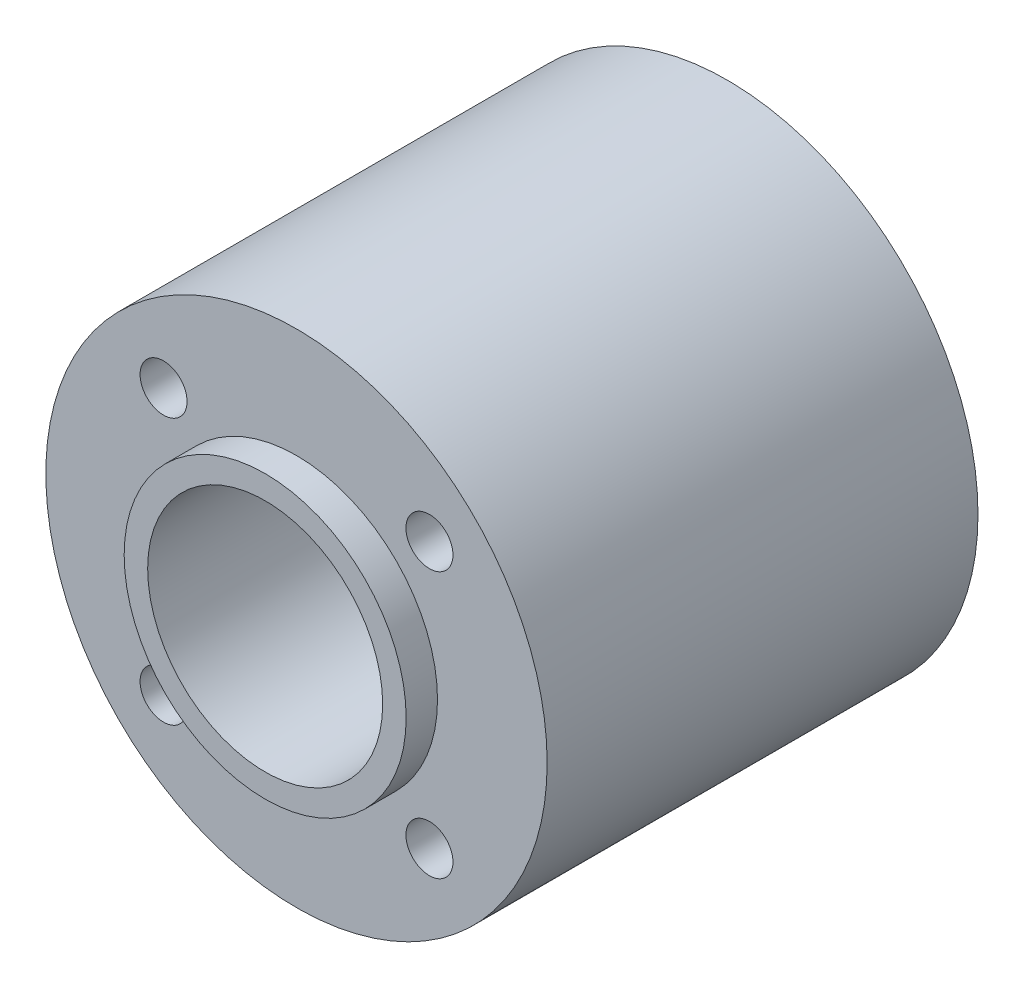
ISO-10303-21;
HEADER;
FILE_DESCRIPTION(('STEP AP214'),'2;1');
FILE_NAME('part.step','',(''),(''),'','','');
FILE_SCHEMA(('AUTOMOTIVE_DESIGN { 1 0 10303 214 1 1 1 1 }'));
ENDSEC;
DATA;
#1=APPLICATION_CONTEXT('core data for automotive mechanical design processes');
#2=APPLICATION_PROTOCOL_DEFINITION('international standard','automotive_design',2000,#1);
#3=PRODUCT_CONTEXT('',#1,'mechanical');
#4=PRODUCT('Part','Part','',(#3));
#5=PRODUCT_RELATED_PRODUCT_CATEGORY('part','',(#4));
#6=PRODUCT_DEFINITION_FORMATION('','',#4);
#7=PRODUCT_DEFINITION_CONTEXT('part definition',#1,'design');
#8=PRODUCT_DEFINITION('design','',#6,#7);
#9=PRODUCT_DEFINITION_SHAPE('','',#8);
#10=(LENGTH_UNIT() NAMED_UNIT(*) SI_UNIT(.MILLI.,.METRE.));
#11=(NAMED_UNIT(*) PLANE_ANGLE_UNIT() SI_UNIT($,.RADIAN.));
#12=(NAMED_UNIT(*) SI_UNIT($,.STERADIAN.) SOLID_ANGLE_UNIT());
#13=UNCERTAINTY_MEASURE_WITH_UNIT(LENGTH_MEASURE(1.E-05),#10,'distance_accuracy_value','');
#14=(GEOMETRIC_REPRESENTATION_CONTEXT(3) GLOBAL_UNCERTAINTY_ASSIGNED_CONTEXT((#13)) GLOBAL_UNIT_ASSIGNED_CONTEXT((#10,
#11,#12)) REPRESENTATION_CONTEXT('',''));
#15=CARTESIAN_POINT('',(0.,0.,0.));
#16=DIRECTION('',(0.,0.,1.));
#17=DIRECTION('',(1.,0.,0.));
#18=AXIS2_PLACEMENT_3D('',#15,#16,#17);
#19=CARTESIAN_POINT('',(0.,0.,-27.5));
#20=DIRECTION('',(0.,0.,1.));
#21=DIRECTION('',(1.,0.,0.));
#22=AXIS2_PLACEMENT_3D('',#19,#20,#21);
#23=CYLINDRICAL_SURFACE('',#22,16.);
#24=CARTESIAN_POINT('',(0.,0.,-27.5));
#25=DIRECTION('',(0.,0.,1.));
#26=DIRECTION('',(1.,0.,0.));
#27=AXIS2_PLACEMENT_3D('',#24,#25,#26);
#28=CIRCLE('',#27,16.);
#29=CARTESIAN_POINT('',(16.,0.,-27.5));
#30=VERTEX_POINT('',#29);
#31=EDGE_CURVE('E11',#30,#30,#28,.T.);
#32=ORIENTED_EDGE('',*,*,#31,.T.);
#33=EDGE_LOOP('',(#32));
#34=FACE_BOUND('',#33,.T.);
#35=CARTESIAN_POINT('',(0.,0.,0.));
#36=DIRECTION('',(0.,0.,1.));
#37=DIRECTION('',(1.,0.,0.));
#38=AXIS2_PLACEMENT_3D('',#35,#36,#37);
#39=CIRCLE('',#38,16.);
#40=CARTESIAN_POINT('',(16.,0.,0.));
#41=VERTEX_POINT('',#40);
#42=EDGE_CURVE('E48',#41,#41,#39,.T.);
#43=ORIENTED_EDGE('',*,*,#42,.F.);
#44=EDGE_LOOP('',(#43));
#45=FACE_BOUND('',#44,.T.);
#46=ADVANCED_FACE('F45',(#34,#45),#23,.T.);
#47=CARTESIAN_POINT('',(0.,0.,-27.5));
#48=DIRECTION('',(0.,0.,1.));
#49=DIRECTION('',(1.,0.,0.));
#50=AXIS2_PLACEMENT_3D('',#47,#48,#49);
#51=CYLINDRICAL_SURFACE('',#50,7.5);
#52=CARTESIAN_POINT('',(0.,0.,2.));
#53=DIRECTION('',(0.,0.,1.));
#54=DIRECTION('',(1.,0.,0.));
#55=AXIS2_PLACEMENT_3D('',#52,#53,#54);
#56=CIRCLE('',#55,7.5);
#57=CARTESIAN_POINT('',(7.5,0.,2.));
#58=VERTEX_POINT('',#57);
#59=EDGE_CURVE('E60',#58,#58,#56,.T.);
#60=ORIENTED_EDGE('',*,*,#59,.T.);
#61=EDGE_LOOP('',(#60));
#62=FACE_BOUND('',#61,.T.);
#63=CARTESIAN_POINT('',(0.,0.,-29.5));
#64=DIRECTION('',(0.,0.,1.));
#65=DIRECTION('',(1.,0.,0.));
#66=AXIS2_PLACEMENT_3D('',#63,#64,#65);
#67=CIRCLE('',#66,7.5);
#68=CARTESIAN_POINT('',(7.5,0.,-29.5));
#69=VERTEX_POINT('',#68);
#70=EDGE_CURVE('E69',#69,#69,#67,.T.);
#71=ORIENTED_EDGE('',*,*,#70,.F.);
#72=EDGE_LOOP('',(#71));
#73=FACE_BOUND('',#72,.T.);
#74=ADVANCED_FACE('F116',(#62,#73),#51,.F.);
#75=CARTESIAN_POINT('',(0.,0.,-27.5));
#76=DIRECTION('',(0.,0.,1.));
#77=DIRECTION('',(1.,0.,0.));
#78=AXIS2_PLACEMENT_3D('',#75,#76,#77);
#79=PLANE('',#78);
#80=CARTESIAN_POINT('',(-8.48528137423814,-8.48528137423853,-27.5));
#81=DIRECTION('',(0.,0.,1.));
#82=DIRECTION('',(1.,0.,0.));
#83=AXIS2_PLACEMENT_3D('',#80,#81,#82);
#84=CIRCLE('',#83,1.50000000000026);
#85=CARTESIAN_POINT('',(-6.98528137423788,-8.48528137423853,-27.5));
#86=VERTEX_POINT('',#85);
#87=EDGE_CURVE('E74',#86,#86,#84,.T.);
#88=ORIENTED_EDGE('',*,*,#87,.T.);
#89=EDGE_LOOP('',(#88));
#90=FACE_BOUND('',#89,.T.);
#91=CARTESIAN_POINT('',(8.48528137423901,-8.48528137423814,-27.5));
#92=DIRECTION('',(0.,0.,1.));
#93=DIRECTION('',(1.,0.,0.));
#94=AXIS2_PLACEMENT_3D('',#91,#92,#93);
#95=CIRCLE('',#94,1.50000000000067);
#96=CARTESIAN_POINT('',(9.98528137423968,-8.48528137423814,-27.5));
#97=VERTEX_POINT('',#96);
#98=EDGE_CURVE('E77',#97,#97,#95,.T.);
#99=ORIENTED_EDGE('',*,*,#98,.T.);
#100=EDGE_LOOP('',(#99));
#101=FACE_BOUND('',#100,.T.);
#102=CARTESIAN_POINT('',(8.48528137423862,8.485281374239,-27.5));
#103=DIRECTION('',(0.,0.,1.));
#104=DIRECTION('',(1.,0.,0.));
#105=AXIS2_PLACEMENT_3D('',#102,#103,#104);
#106=CIRCLE('',#105,1.50000000000049);
#107=CARTESIAN_POINT('',(9.98528137423911,8.485281374239,-27.5));
#108=VERTEX_POINT('',#107);
#109=EDGE_CURVE('E80',#108,#108,#106,.T.);
#110=ORIENTED_EDGE('',*,*,#109,.T.);
#111=EDGE_LOOP('',(#110));
#112=FACE_BOUND('',#111,.T.);
#113=CARTESIAN_POINT('',(-8.48528137423853,8.48528137423861,-27.5));
#114=DIRECTION('',(0.,0.,1.));
#115=DIRECTION('',(1.,0.,0.));
#116=AXIS2_PLACEMENT_3D('',#113,#114,#115);
#117=CIRCLE('',#116,1.5);
#118=CARTESIAN_POINT('',(-6.98528137423853,8.48528137423861,-27.5));
#119=VERTEX_POINT('',#118);
#120=EDGE_CURVE('E83',#119,#119,#117,.T.);
#121=ORIENTED_EDGE('',*,*,#120,.T.);
#122=EDGE_LOOP('',(#121));
#123=FACE_BOUND('',#122,.T.);
#124=CARTESIAN_POINT('',(0.,0.,-27.5));
#125=DIRECTION('',(0.,0.,1.));
#126=DIRECTION('',(1.,0.,0.));
#127=AXIS2_PLACEMENT_3D('',#124,#125,#126);
#128=CIRCLE('',#127,9.);
#129=CARTESIAN_POINT('',(9.,0.,-27.5));
#130=VERTEX_POINT('',#129);
#131=EDGE_CURVE('E66',#130,#130,#128,.T.);
#132=ORIENTED_EDGE('',*,*,#131,.T.);
#133=EDGE_LOOP('',(#132));
#134=FACE_BOUND('',#133,.T.);
#135=ORIENTED_EDGE('',*,*,#31,.F.);
#136=EDGE_LOOP('',(#135));
#137=FACE_BOUND('',#136,.T.);
#138=ADVANCED_FACE('F106',(#90,#101,#112,#123,#134,#137),#79,.F.);
#139=CARTESIAN_POINT('',(0.,0.,0.));
#140=DIRECTION('',(0.,0.,1.));
#141=DIRECTION('',(1.,0.,0.));
#142=AXIS2_PLACEMENT_3D('',#139,#140,#141);
#143=PLANE('',#142);
#144=CARTESIAN_POINT('',(-8.48528137423814,-8.48528137423853,0.));
#145=DIRECTION('',(0.,0.,1.));
#146=DIRECTION('',(1.,0.,0.));
#147=AXIS2_PLACEMENT_3D('',#144,#145,#146);
#148=CIRCLE('',#147,1.50000000000026);
#149=CARTESIAN_POINT('',(-6.98528137423788,-8.48528137423853,0.));
#150=VERTEX_POINT('',#149);
#151=EDGE_CURVE('E90',#150,#150,#148,.T.);
#152=ORIENTED_EDGE('',*,*,#151,.F.);
#153=EDGE_LOOP('',(#152));
#154=FACE_BOUND('',#153,.T.);
#155=CARTESIAN_POINT('',(8.48528137423901,-8.48528137423814,0.));
#156=DIRECTION('',(0.,0.,1.));
#157=DIRECTION('',(1.,0.,0.));
#158=AXIS2_PLACEMENT_3D('',#155,#156,#157);
#159=CIRCLE('',#158,1.50000000000067);
#160=CARTESIAN_POINT('',(9.98528137423968,-8.48528137423814,0.));
#161=VERTEX_POINT('',#160);
#162=EDGE_CURVE('E93',#161,#161,#159,.T.);
#163=ORIENTED_EDGE('',*,*,#162,.F.);
#164=EDGE_LOOP('',(#163));
#165=FACE_BOUND('',#164,.T.);
#166=CARTESIAN_POINT('',(8.48528137423862,8.485281374239,0.));
#167=DIRECTION('',(0.,0.,1.));
#168=DIRECTION('',(1.,0.,0.));
#169=AXIS2_PLACEMENT_3D('',#166,#167,#168);
#170=CIRCLE('',#169,1.50000000000049);
#171=CARTESIAN_POINT('',(9.98528137423911,8.485281374239,0.));
#172=VERTEX_POINT('',#171);
#173=EDGE_CURVE('E89',#172,#172,#170,.T.);
#174=ORIENTED_EDGE('',*,*,#173,.F.);
#175=EDGE_LOOP('',(#174));
#176=FACE_BOUND('',#175,.T.);
#177=CARTESIAN_POINT('',(-8.48528137423853,8.48528137423861,0.));
#178=DIRECTION('',(0.,0.,1.));
#179=DIRECTION('',(1.,0.,0.));
#180=AXIS2_PLACEMENT_3D('',#177,#178,#179);
#181=CIRCLE('',#180,1.5);
#182=CARTESIAN_POINT('',(-6.98528137423853,8.48528137423861,0.));
#183=VERTEX_POINT('',#182);
#184=EDGE_CURVE('E86',#183,#183,#181,.T.);
#185=ORIENTED_EDGE('',*,*,#184,.F.);
#186=EDGE_LOOP('',(#185));
#187=FACE_BOUND('',#186,.T.);
#188=CARTESIAN_POINT('',(0.,0.,0.));
#189=DIRECTION('',(0.,0.,1.));
#190=DIRECTION('',(1.,0.,0.));
#191=AXIS2_PLACEMENT_3D('',#188,#189,#190);
#192=CIRCLE('',#191,9.);
#193=CARTESIAN_POINT('',(9.,0.,0.));
#194=VERTEX_POINT('',#193);
#195=EDGE_CURVE('E57',#194,#194,#192,.T.);
#196=ORIENTED_EDGE('',*,*,#195,.F.);
#197=EDGE_LOOP('',(#196));
#198=FACE_BOUND('',#197,.T.);
#199=ORIENTED_EDGE('',*,*,#42,.T.);
#200=EDGE_LOOP('',(#199));
#201=FACE_BOUND('',#200,.T.);
#202=ADVANCED_FACE('F102',(#154,#165,#176,#187,#198,#201),#143,.T.);
#203=CARTESIAN_POINT('',(0.,0.,2.));
#204=DIRECTION('',(0.,0.,-1.));
#205=DIRECTION('',(-1.,0.,0.));
#206=AXIS2_PLACEMENT_3D('',#203,#204,#205);
#207=CYLINDRICAL_SURFACE('',#206,9.);
#208=CARTESIAN_POINT('',(0.,0.,2.));
#209=DIRECTION('',(0.,0.,1.));
#210=DIRECTION('',(1.,0.,0.));
#211=AXIS2_PLACEMENT_3D('',#208,#209,#210);
#212=CIRCLE('',#211,9.);
#213=CARTESIAN_POINT('',(9.,0.,2.));
#214=VERTEX_POINT('',#213);
#215=EDGE_CURVE('E55',#214,#214,#212,.T.);
#216=ORIENTED_EDGE('',*,*,#215,.F.);
#217=EDGE_LOOP('',(#216));
#218=FACE_BOUND('',#217,.T.);
#219=ORIENTED_EDGE('',*,*,#195,.T.);
#220=EDGE_LOOP('',(#219));
#221=FACE_BOUND('',#220,.T.);
#222=ADVANCED_FACE('F105',(#218,#221),#207,.T.);
#223=CARTESIAN_POINT('',(0.,0.,2.));
#224=DIRECTION('',(0.,0.,1.));
#225=DIRECTION('',(1.,0.,0.));
#226=AXIS2_PLACEMENT_3D('',#223,#224,#225);
#227=PLANE('',#226);
#228=ORIENTED_EDGE('',*,*,#59,.F.);
#229=EDGE_LOOP('',(#228));
#230=FACE_BOUND('',#229,.T.);
#231=ORIENTED_EDGE('',*,*,#215,.T.);
#232=EDGE_LOOP('',(#231));
#233=FACE_BOUND('',#232,.T.);
#234=ADVANCED_FACE('F130',(#230,#233),#227,.T.);
#235=CARTESIAN_POINT('',(0.,0.,-29.5));
#236=DIRECTION('',(0.,0.,1.));
#237=DIRECTION('',(1.,0.,0.));
#238=AXIS2_PLACEMENT_3D('',#235,#236,#237);
#239=CYLINDRICAL_SURFACE('',#238,9.);
#240=CARTESIAN_POINT('',(0.,0.,-29.5));
#241=DIRECTION('',(0.,0.,1.));
#242=DIRECTION('',(1.,0.,0.));
#243=AXIS2_PLACEMENT_3D('',#240,#241,#242);
#244=CIRCLE('',#243,9.);
#245=CARTESIAN_POINT('',(9.,0.,-29.5));
#246=VERTEX_POINT('',#245);
#247=EDGE_CURVE('E61',#246,#246,#244,.T.);
#248=ORIENTED_EDGE('',*,*,#247,.T.);
#249=EDGE_LOOP('',(#248));
#250=FACE_BOUND('',#249,.T.);
#251=ORIENTED_EDGE('',*,*,#131,.F.);
#252=EDGE_LOOP('',(#251));
#253=FACE_BOUND('',#252,.T.);
#254=ADVANCED_FACE('F134',(#250,#253),#239,.T.);
#255=CARTESIAN_POINT('',(0.,0.,-29.5));
#256=DIRECTION('',(0.,0.,1.));
#257=DIRECTION('',(1.,0.,0.));
#258=AXIS2_PLACEMENT_3D('',#255,#256,#257);
#259=PLANE('',#258);
#260=ORIENTED_EDGE('',*,*,#70,.T.);
#261=EDGE_LOOP('',(#260));
#262=FACE_BOUND('',#261,.T.);
#263=ORIENTED_EDGE('',*,*,#247,.F.);
#264=EDGE_LOOP('',(#263));
#265=FACE_BOUND('',#264,.T.);
#266=ADVANCED_FACE('F138',(#262,#265),#259,.F.);
#267=CARTESIAN_POINT('',(-8.48528137423853,8.48528137423861,-29.5));
#268=DIRECTION('',(0.,0.,1.));
#269=DIRECTION('',(1.,0.,0.));
#270=AXIS2_PLACEMENT_3D('',#267,#268,#269);
#271=CYLINDRICAL_SURFACE('',#270,1.5);
#272=ORIENTED_EDGE('',*,*,#184,.T.);
#273=EDGE_LOOP('',(#272));
#274=FACE_BOUND('',#273,.T.);
#275=ORIENTED_EDGE('',*,*,#120,.F.);
#276=EDGE_LOOP('',(#275));
#277=FACE_BOUND('',#276,.T.);
#278=ADVANCED_FACE('F142',(#274,#277),#271,.F.);
#279=CARTESIAN_POINT('',(8.48528137423862,8.485281374239,-29.5));
#280=DIRECTION('',(0.,0.,1.));
#281=DIRECTION('',(1.,0.,0.));
#282=AXIS2_PLACEMENT_3D('',#279,#280,#281);
#283=CYLINDRICAL_SURFACE('',#282,1.50000000000049);
#284=ORIENTED_EDGE('',*,*,#173,.T.);
#285=EDGE_LOOP('',(#284));
#286=FACE_BOUND('',#285,.T.);
#287=ORIENTED_EDGE('',*,*,#109,.F.);
#288=EDGE_LOOP('',(#287));
#289=FACE_BOUND('',#288,.T.);
#290=ADVANCED_FACE('F99',(#286,#289),#283,.F.);
#291=CARTESIAN_POINT('',(8.48528137423901,-8.48528137423814,-29.5));
#292=DIRECTION('',(0.,0.,1.));
#293=DIRECTION('',(1.,0.,0.));
#294=AXIS2_PLACEMENT_3D('',#291,#292,#293);
#295=CYLINDRICAL_SURFACE('',#294,1.50000000000067);
#296=ORIENTED_EDGE('',*,*,#162,.T.);
#297=EDGE_LOOP('',(#296));
#298=FACE_BOUND('',#297,.T.);
#299=ORIENTED_EDGE('',*,*,#98,.F.);
#300=EDGE_LOOP('',(#299));
#301=FACE_BOUND('',#300,.T.);
#302=ADVANCED_FACE('F150',(#298,#301),#295,.F.);
#303=CARTESIAN_POINT('',(-8.48528137423814,-8.48528137423853,-29.5));
#304=DIRECTION('',(0.,0.,1.));
#305=DIRECTION('',(1.,0.,0.));
#306=AXIS2_PLACEMENT_3D('',#303,#304,#305);
#307=CYLINDRICAL_SURFACE('',#306,1.50000000000026);
#308=ORIENTED_EDGE('',*,*,#151,.T.);
#309=EDGE_LOOP('',(#308));
#310=FACE_BOUND('',#309,.T.);
#311=ORIENTED_EDGE('',*,*,#87,.F.);
#312=EDGE_LOOP('',(#311));
#313=FACE_BOUND('',#312,.T.);
#314=ADVANCED_FACE('F147',(#310,#313),#307,.F.);
#315=CLOSED_SHELL('',(#46,#74,#138,#202,#222,#234,#254,#266,#278,#290,#302,#314));
#316=MANIFOLD_SOLID_BREP('B2',#315);
#317=ADVANCED_BREP_SHAPE_REPRESENTATION('',(#18,#316),#14);
#318=SHAPE_DEFINITION_REPRESENTATION(#9,#317);
ENDSEC;
END-ISO-10303-21;
